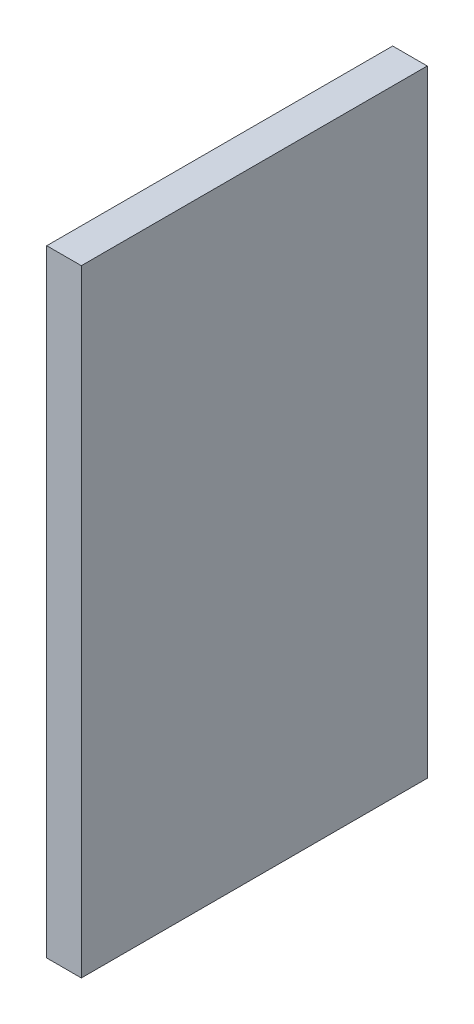
ISO-10303-21;
HEADER;
FILE_DESCRIPTION(('STEP AP214'),'2;1');
FILE_NAME('part.step','',(''),(''),'','','');
FILE_SCHEMA(('AUTOMOTIVE_DESIGN { 1 0 10303 214 1 1 1 1 }'));
ENDSEC;
DATA;
#1=APPLICATION_CONTEXT('core data for automotive mechanical design processes');
#2=APPLICATION_PROTOCOL_DEFINITION('international standard','automotive_design',2000,#1);
#3=PRODUCT_CONTEXT('',#1,'mechanical');
#4=PRODUCT('Part','Part','',(#3));
#5=PRODUCT_RELATED_PRODUCT_CATEGORY('part','',(#4));
#6=PRODUCT_DEFINITION_FORMATION('','',#4);
#7=PRODUCT_DEFINITION_CONTEXT('part definition',#1,'design');
#8=PRODUCT_DEFINITION('design','',#6,#7);
#9=PRODUCT_DEFINITION_SHAPE('','',#8);
#10=(LENGTH_UNIT() NAMED_UNIT(*) SI_UNIT(.MILLI.,.METRE.));
#11=(NAMED_UNIT(*) PLANE_ANGLE_UNIT() SI_UNIT($,.RADIAN.));
#12=(NAMED_UNIT(*) SI_UNIT($,.STERADIAN.) SOLID_ANGLE_UNIT());
#13=UNCERTAINTY_MEASURE_WITH_UNIT(LENGTH_MEASURE(1.E-05),#10,'distance_accuracy_value','');
#14=(GEOMETRIC_REPRESENTATION_CONTEXT(3) GLOBAL_UNCERTAINTY_ASSIGNED_CONTEXT((#13)) GLOBAL_UNIT_ASSIGNED_CONTEXT((#10,
#11,#12)) REPRESENTATION_CONTEXT('',''));
#15=CARTESIAN_POINT('',(0.,0.,0.));
#16=DIRECTION('',(0.,0.,1.));
#17=DIRECTION('',(1.,0.,0.));
#18=AXIS2_PLACEMENT_3D('',#15,#16,#17);
#19=CARTESIAN_POINT('',(2.99999999999999,53.5,60.));
#20=DIRECTION('',(-1.,0.,0.));
#21=DIRECTION('',(0.,-1.,0.));
#22=AXIS2_PLACEMENT_3D('',#19,#20,#21);
#23=PLANE('',#22);
#24=DIRECTION('',(0.,1.,0.));
#25=VECTOR('',#24,1.);
#26=CARTESIAN_POINT('',(2.99999999999999,53.5,0.));
#27=LINE('',#26,#25);
#28=CARTESIAN_POINT('',(3.00000000000001,-53.5,0.));
#29=VERTEX_POINT('',#28);
#30=CARTESIAN_POINT('',(2.99999999999999,53.5,0.));
#31=VERTEX_POINT('',#30);
#32=EDGE_CURVE('E96',#29,#31,#27,.T.);
#33=ORIENTED_EDGE('',*,*,#32,.T.);
#34=DIRECTION('',(0.,0.,-1.));
#35=VECTOR('',#34,1.);
#36=CARTESIAN_POINT('',(2.99999999999999,53.5,60.));
#37=LINE('',#36,#35);
#38=CARTESIAN_POINT('',(2.99999999999999,53.5,60.));
#39=VERTEX_POINT('',#38);
#40=EDGE_CURVE('E11',#39,#31,#37,.T.);
#41=ORIENTED_EDGE('',*,*,#40,.F.);
#42=DIRECTION('',(0.,1.,0.));
#43=VECTOR('',#42,1.);
#44=CARTESIAN_POINT('',(2.99999999999999,53.5,60.));
#45=LINE('',#44,#43);
#46=CARTESIAN_POINT('',(3.00000000000001,-53.5,60.));
#47=VERTEX_POINT('',#46);
#48=EDGE_CURVE('E84',#47,#39,#45,.T.);
#49=ORIENTED_EDGE('',*,*,#48,.F.);
#50=DIRECTION('',(0.,0.,-1.));
#51=VECTOR('',#50,1.);
#52=CARTESIAN_POINT('',(3.00000000000001,-53.5,60.));
#53=LINE('',#52,#51);
#54=EDGE_CURVE('E92',#47,#29,#53,.T.);
#55=ORIENTED_EDGE('',*,*,#54,.T.);
#56=EDGE_LOOP('',(#33,#41,#49,#55));
#57=FACE_BOUND('',#56,.T.);
#58=ADVANCED_FACE('F33',(#57),#23,.F.);
#59=CARTESIAN_POINT('',(-3.00000000000001,53.5,60.));
#60=DIRECTION('',(0.,-1.,0.));
#61=DIRECTION('',(0.,0.,-1.));
#62=AXIS2_PLACEMENT_3D('',#59,#60,#61);
#63=PLANE('',#62);
#64=DIRECTION('',(-1.,0.,0.));
#65=VECTOR('',#64,1.);
#66=CARTESIAN_POINT('',(-3.00000000000001,53.5,0.));
#67=LINE('',#66,#65);
#68=CARTESIAN_POINT('',(-3.00000000000001,53.5,0.));
#69=VERTEX_POINT('',#68);
#70=EDGE_CURVE('E88',#31,#69,#67,.T.);
#71=ORIENTED_EDGE('',*,*,#70,.T.);
#72=DIRECTION('',(0.,0.,-1.));
#73=VECTOR('',#72,1.);
#74=CARTESIAN_POINT('',(-3.00000000000001,53.5,60.));
#75=LINE('',#74,#73);
#76=CARTESIAN_POINT('',(-3.00000000000001,53.5,60.));
#77=VERTEX_POINT('',#76);
#78=EDGE_CURVE('E41',#77,#69,#75,.T.);
#79=ORIENTED_EDGE('',*,*,#78,.F.);
#80=DIRECTION('',(-1.,0.,0.));
#81=VECTOR('',#80,1.);
#82=CARTESIAN_POINT('',(-3.00000000000001,53.5,60.));
#83=LINE('',#82,#81);
#84=EDGE_CURVE('E79',#39,#77,#83,.T.);
#85=ORIENTED_EDGE('',*,*,#84,.F.);
#86=ORIENTED_EDGE('',*,*,#40,.T.);
#87=EDGE_LOOP('',(#71,#79,#85,#86));
#88=FACE_BOUND('',#87,.T.);
#89=ADVANCED_FACE('F87',(#88),#63,.F.);
#90=CARTESIAN_POINT('',(-3.00000000000001,53.5,60.));
#91=DIRECTION('',(1.,0.,0.));
#92=DIRECTION('',(0.,1.,0.));
#93=AXIS2_PLACEMENT_3D('',#90,#91,#92);
#94=PLANE('',#93);
#95=DIRECTION('',(0.,-1.,0.));
#96=VECTOR('',#95,1.);
#97=CARTESIAN_POINT('',(-3.00000000000001,53.5,0.));
#98=LINE('',#97,#96);
#99=CARTESIAN_POINT('',(-2.99999999999999,-53.5,0.));
#100=VERTEX_POINT('',#99);
#101=EDGE_CURVE('E66',#69,#100,#98,.T.);
#102=ORIENTED_EDGE('',*,*,#101,.T.);
#103=DIRECTION('',(0.,0.,-1.));
#104=VECTOR('',#103,1.);
#105=CARTESIAN_POINT('',(-2.99999999999999,-53.5,60.));
#106=LINE('',#105,#104);
#107=CARTESIAN_POINT('',(-2.99999999999999,-53.5,60.));
#108=VERTEX_POINT('',#107);
#109=EDGE_CURVE('E89',#108,#100,#106,.T.);
#110=ORIENTED_EDGE('',*,*,#109,.F.);
#111=DIRECTION('',(0.,-1.,0.));
#112=VECTOR('',#111,1.);
#113=CARTESIAN_POINT('',(-3.00000000000001,53.5,60.));
#114=LINE('',#113,#112);
#115=EDGE_CURVE('E82',#77,#108,#114,.T.);
#116=ORIENTED_EDGE('',*,*,#115,.F.);
#117=ORIENTED_EDGE('',*,*,#78,.T.);
#118=EDGE_LOOP('',(#102,#110,#116,#117));
#119=FACE_BOUND('',#118,.T.);
#120=ADVANCED_FACE('F90',(#119),#94,.F.);
#121=CARTESIAN_POINT('',(-2.99999999999999,-53.5,60.));
#122=DIRECTION('',(0.,1.,0.));
#123=DIRECTION('',(0.,0.,1.));
#124=AXIS2_PLACEMENT_3D('',#121,#122,#123);
#125=PLANE('',#124);
#126=DIRECTION('',(1.,0.,0.));
#127=VECTOR('',#126,1.);
#128=CARTESIAN_POINT('',(-2.99999999999999,-53.5,0.));
#129=LINE('',#128,#127);
#130=EDGE_CURVE('E72',#100,#29,#129,.T.);
#131=ORIENTED_EDGE('',*,*,#130,.T.);
#132=ORIENTED_EDGE('',*,*,#54,.F.);
#133=DIRECTION('',(1.,0.,0.));
#134=VECTOR('',#133,1.);
#135=CARTESIAN_POINT('',(-2.99999999999999,-53.5,60.));
#136=LINE('',#135,#134);
#137=EDGE_CURVE('E49',#108,#47,#136,.T.);
#138=ORIENTED_EDGE('',*,*,#137,.F.);
#139=ORIENTED_EDGE('',*,*,#109,.T.);
#140=EDGE_LOOP('',(#131,#132,#138,#139));
#141=FACE_BOUND('',#140,.T.);
#142=ADVANCED_FACE('F103',(#141),#125,.F.);
#143=CARTESIAN_POINT('',(0.,0.,60.));
#144=DIRECTION('',(0.,0.,1.));
#145=DIRECTION('',(1.,0.,0.));
#146=AXIS2_PLACEMENT_3D('',#143,#144,#145);
#147=PLANE('',#146);
#148=ORIENTED_EDGE('',*,*,#48,.T.);
#149=ORIENTED_EDGE('',*,*,#84,.T.);
#150=ORIENTED_EDGE('',*,*,#115,.T.);
#151=ORIENTED_EDGE('',*,*,#137,.T.);
#152=EDGE_LOOP('',(#148,#149,#150,#151));
#153=FACE_BOUND('',#152,.T.);
#154=ADVANCED_FACE('F80',(#153),#147,.T.);
#155=CARTESIAN_POINT('',(0.,0.,0.));
#156=DIRECTION('',(0.,0.,1.));
#157=DIRECTION('',(1.,0.,0.));
#158=AXIS2_PLACEMENT_3D('',#155,#156,#157);
#159=PLANE('',#158);
#160=ORIENTED_EDGE('',*,*,#32,.F.);
#161=ORIENTED_EDGE('',*,*,#130,.F.);
#162=ORIENTED_EDGE('',*,*,#101,.F.);
#163=ORIENTED_EDGE('',*,*,#70,.F.);
#164=EDGE_LOOP('',(#160,#161,#162,#163));
#165=FACE_BOUND('',#164,.T.);
#166=ADVANCED_FACE('F106',(#165),#159,.F.);
#167=CLOSED_SHELL('',(#58,#89,#120,#142,#154,#166));
#168=MANIFOLD_SOLID_BREP('B2',#167);
#169=ADVANCED_BREP_SHAPE_REPRESENTATION('',(#18,#168),#14);
#170=SHAPE_DEFINITION_REPRESENTATION(#9,#169);
ENDSEC;
END-ISO-10303-21;
